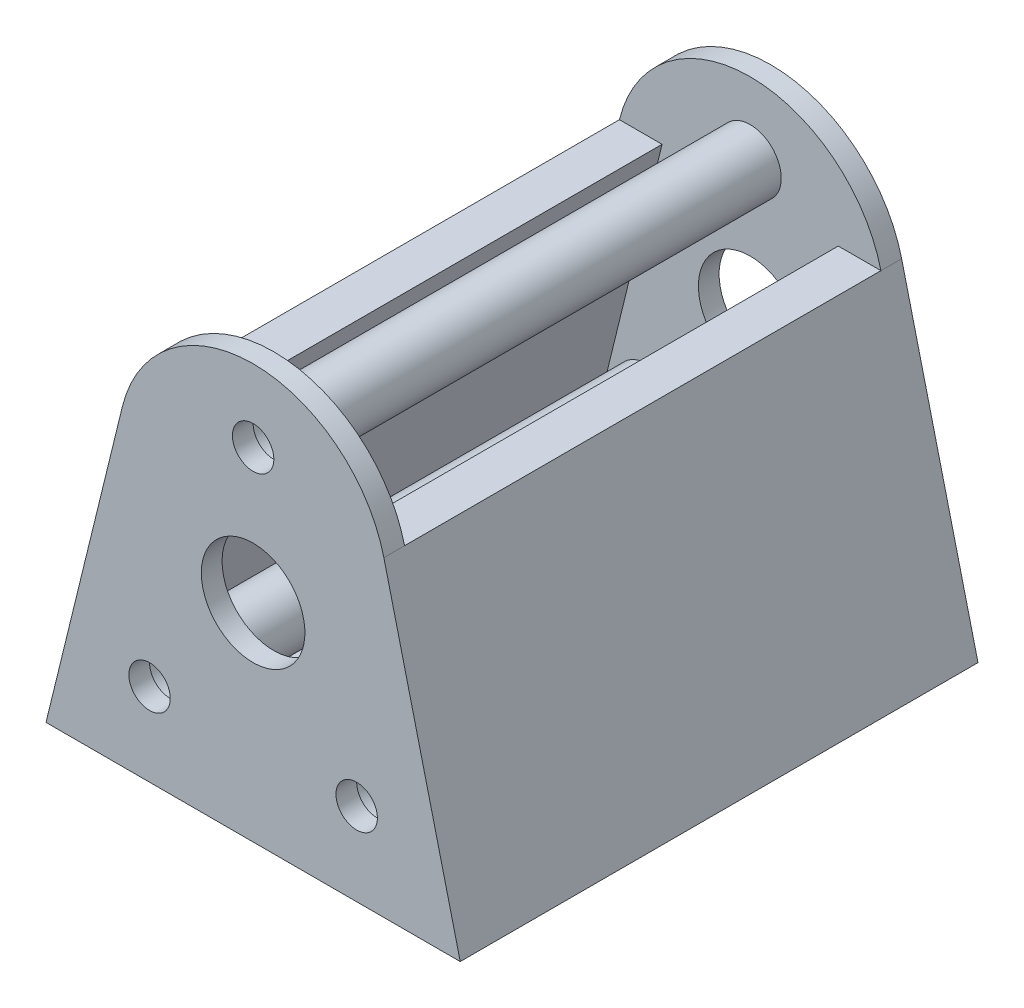
ISO-10303-21;
HEADER;
FILE_DESCRIPTION(('STEP AP214'),'2;1');
FILE_NAME('part.step','',(''),(''),'','','');
FILE_SCHEMA(('AUTOMOTIVE_DESIGN { 1 0 10303 214 1 1 1 1 }'));
ENDSEC;
DATA;
#1=APPLICATION_CONTEXT('core data for automotive mechanical design processes');
#2=APPLICATION_PROTOCOL_DEFINITION('international standard','automotive_design',2000,#1);
#3=PRODUCT_CONTEXT('',#1,'mechanical');
#4=PRODUCT('Part','Part','',(#3));
#5=PRODUCT_RELATED_PRODUCT_CATEGORY('part','',(#4));
#6=PRODUCT_DEFINITION_FORMATION('','',#4);
#7=PRODUCT_DEFINITION_CONTEXT('part definition',#1,'design');
#8=PRODUCT_DEFINITION('design','',#6,#7);
#9=PRODUCT_DEFINITION_SHAPE('','',#8);
#10=(LENGTH_UNIT() NAMED_UNIT(*) SI_UNIT(.MILLI.,.METRE.));
#11=(NAMED_UNIT(*) PLANE_ANGLE_UNIT() SI_UNIT($,.RADIAN.));
#12=(NAMED_UNIT(*) SI_UNIT($,.STERADIAN.) SOLID_ANGLE_UNIT());
#13=UNCERTAINTY_MEASURE_WITH_UNIT(LENGTH_MEASURE(1.E-05),#10,'distance_accuracy_value','');
#14=(GEOMETRIC_REPRESENTATION_CONTEXT(3) GLOBAL_UNCERTAINTY_ASSIGNED_CONTEXT((#13)) GLOBAL_UNIT_ASSIGNED_CONTEXT((#10,
#11,#12)) REPRESENTATION_CONTEXT('',''));
#15=CARTESIAN_POINT('',(0.,0.,0.));
#16=DIRECTION('',(0.,0.,1.));
#17=DIRECTION('',(1.,0.,0.));
#18=AXIS2_PLACEMENT_3D('',#15,#16,#17);
#19=CARTESIAN_POINT('',(0.,27.,2.));
#20=DIRECTION('',(0.,0.,1.));
#21=DIRECTION('',(1.,0.,0.));
#22=AXIS2_PLACEMENT_3D('',#19,#20,#21);
#23=PLANE('',#22);
#24=CARTESIAN_POINT('',(10.,8.,2.));
#25=DIRECTION('',(0.,0.,1.));
#26=DIRECTION('',(1.,0.,0.));
#27=AXIS2_PLACEMENT_3D('',#24,#25,#26);
#28=CIRCLE('',#27,3.);
#29=CARTESIAN_POINT('',(13.,8.,2.));
#30=VERTEX_POINT('',#29);
#31=EDGE_CURVE('E183',#30,#30,#28,.T.);
#32=ORIENTED_EDGE('',*,*,#31,.F.);
#33=EDGE_LOOP('',(#32));
#34=FACE_BOUND('',#33,.T.);
#35=CARTESIAN_POINT('',(0.,33.,2.));
#36=DIRECTION('',(0.,0.,1.));
#37=DIRECTION('',(1.,0.,0.));
#38=AXIS2_PLACEMENT_3D('',#35,#36,#37);
#39=CIRCLE('',#38,3.);
#40=CARTESIAN_POINT('',(3.,33.,2.));
#41=VERTEX_POINT('',#40);
#42=EDGE_CURVE('E187',#41,#41,#39,.T.);
#43=ORIENTED_EDGE('',*,*,#42,.F.);
#44=EDGE_LOOP('',(#43));
#45=FACE_BOUND('',#44,.T.);
#46=CARTESIAN_POINT('',(-10.,8.,2.));
#47=DIRECTION('',(0.,0.,1.));
#48=DIRECTION('',(1.,0.,0.));
#49=AXIS2_PLACEMENT_3D('',#46,#47,#48);
#50=CIRCLE('',#49,3.);
#51=CARTESIAN_POINT('',(-7.,8.,2.));
#52=VERTEX_POINT('',#51);
#53=EDGE_CURVE('E242',#52,#52,#50,.T.);
#54=ORIENTED_EDGE('',*,*,#53,.F.);
#55=EDGE_LOOP('',(#54));
#56=FACE_BOUND('',#55,.T.);
#57=CARTESIAN_POINT('',(0.,20.,2.));
#58=DIRECTION('',(0.,0.,1.));
#59=DIRECTION('',(1.,0.,0.));
#60=AXIS2_PLACEMENT_3D('',#57,#58,#59);
#61=CIRCLE('',#60,5.);
#62=CARTESIAN_POINT('',(5.,20.,2.));
#63=VERTEX_POINT('',#62);
#64=EDGE_CURVE('E264',#63,#63,#61,.T.);
#65=ORIENTED_EDGE('',*,*,#64,.F.);
#66=EDGE_LOOP('',(#65));
#67=FACE_BOUND('',#66,.T.);
#68=DIRECTION('',(0.23797815358121,-0.971270507334634,0.));
#69=VECTOR('',#68,1.);
#70=CARTESIAN_POINT('',(14.9016133230341,4.00000000000001,2.));
#71=LINE('',#70,#69);
#72=CARTESIAN_POINT('',(8.50819943263023,30.0937159965557,2.));
#73=VERTEX_POINT('',#72);
#74=CARTESIAN_POINT('',(14.9016133230341,4.00000000000001,2.));
#75=VERTEX_POINT('',#74);
#76=EDGE_CURVE('E60',#73,#75,#71,.T.);
#77=ORIENTED_EDGE('',*,*,#76,.F.);
#78=DIRECTION('',(-1.,0.,0.));
#79=VECTOR('',#78,1.);
#80=CARTESIAN_POINT('',(12.6265165953502,30.0937159965557,2.));
#81=LINE('',#80,#79);
#82=CARTESIAN_POINT('',(12.6265165953502,30.0937159965557,2.));
#83=VERTEX_POINT('',#82);
#84=EDGE_CURVE('E146',#83,#73,#81,.T.);
#85=ORIENTED_EDGE('',*,*,#84,.F.);
#86=CARTESIAN_POINT('',(0.,27.,2.));
#87=DIRECTION('',(0.,0.,1.));
#88=DIRECTION('',(1.,0.,0.));
#89=AXIS2_PLACEMENT_3D('',#86,#87,#88);
#90=CIRCLE('',#89,13.);
#91=CARTESIAN_POINT('',(-12.6265165953502,30.0937159965557,2.));
#92=VERTEX_POINT('',#91);
#93=EDGE_CURVE('E138',#83,#92,#90,.T.);
#94=ORIENTED_EDGE('',*,*,#93,.T.);
#95=DIRECTION('',(-1.,0.,0.));
#96=VECTOR('',#95,1.);
#97=CARTESIAN_POINT('',(-12.6265165953502,30.0937159965557,2.));
#98=LINE('',#97,#96);
#99=CARTESIAN_POINT('',(-8.50819943263023,30.0937159965557,2.));
#100=VERTEX_POINT('',#99);
#101=EDGE_CURVE('E158',#100,#92,#98,.T.);
#102=ORIENTED_EDGE('',*,*,#101,.F.);
#103=DIRECTION('',(0.23797815358121,0.971270507334634,0.));
#104=VECTOR('',#103,1.);
#105=CARTESIAN_POINT('',(-14.9016133230341,4.00000000000001,2.));
#106=LINE('',#105,#104);
#107=CARTESIAN_POINT('',(-14.9016133230341,4.00000000000001,2.));
#108=VERTEX_POINT('',#107);
#109=EDGE_CURVE('E162',#108,#100,#106,.T.);
#110=ORIENTED_EDGE('',*,*,#109,.F.);
#111=DIRECTION('',(-1.,0.,0.));
#112=VECTOR('',#111,1.);
#113=CARTESIAN_POINT('',(-19.0199304857541,4.00000000000001,2.));
#114=LINE('',#113,#112);
#115=EDGE_CURVE('E181',#75,#108,#114,.T.);
#116=ORIENTED_EDGE('',*,*,#115,.F.);
#117=EDGE_LOOP('',(#77,#85,#94,#102,#110,#116));
#118=FACE_BOUND('',#117,.T.);
#119=ADVANCED_FACE('F45',(#34,#45,#56,#67,#118),#23,.T.);
#120=CARTESIAN_POINT('',(0.,27.,48.));
#121=DIRECTION('',(0.,0.,-1.));
#122=DIRECTION('',(-1.,0.,0.));
#123=AXIS2_PLACEMENT_3D('',#120,#121,#122);
#124=PLANE('',#123);
#125=CARTESIAN_POINT('',(10.,8.,48.));
#126=DIRECTION('',(0.,0.,-1.));
#127=DIRECTION('',(1.,0.,0.));
#128=AXIS2_PLACEMENT_3D('',#125,#126,#127);
#129=CIRCLE('',#128,3.);
#130=CARTESIAN_POINT('',(13.,8.,48.));
#131=VERTEX_POINT('',#130);
#132=EDGE_CURVE('E184',#131,#131,#129,.T.);
#133=ORIENTED_EDGE('',*,*,#132,.F.);
#134=EDGE_LOOP('',(#133));
#135=FACE_BOUND('',#134,.T.);
#136=CARTESIAN_POINT('',(0.,33.,48.));
#137=DIRECTION('',(0.,0.,-1.));
#138=DIRECTION('',(-1.,0.,0.));
#139=AXIS2_PLACEMENT_3D('',#136,#137,#138);
#140=CIRCLE('',#139,3.);
#141=CARTESIAN_POINT('',(-3.,33.,48.));
#142=VERTEX_POINT('',#141);
#143=EDGE_CURVE('E190',#142,#142,#140,.T.);
#144=ORIENTED_EDGE('',*,*,#143,.F.);
#145=EDGE_LOOP('',(#144));
#146=FACE_BOUND('',#145,.T.);
#147=CARTESIAN_POINT('',(-10.,8.,48.));
#148=DIRECTION('',(0.,0.,-1.));
#149=DIRECTION('',(-1.,0.,0.));
#150=AXIS2_PLACEMENT_3D('',#147,#148,#149);
#151=CIRCLE('',#150,3.);
#152=CARTESIAN_POINT('',(-13.,8.,48.));
#153=VERTEX_POINT('',#152);
#154=EDGE_CURVE('E236',#153,#153,#151,.T.);
#155=ORIENTED_EDGE('',*,*,#154,.F.);
#156=EDGE_LOOP('',(#155));
#157=FACE_BOUND('',#156,.T.);
#158=CARTESIAN_POINT('',(0.,20.,48.));
#159=DIRECTION('',(0.,0.,-1.));
#160=DIRECTION('',(-1.,0.,0.));
#161=AXIS2_PLACEMENT_3D('',#158,#159,#160);
#162=CIRCLE('',#161,5.);
#163=CARTESIAN_POINT('',(-5.,20.,48.));
#164=VERTEX_POINT('',#163);
#165=EDGE_CURVE('E214',#164,#164,#162,.T.);
#166=ORIENTED_EDGE('',*,*,#165,.F.);
#167=EDGE_LOOP('',(#166));
#168=FACE_BOUND('',#167,.T.);
#169=CARTESIAN_POINT('',(0.,27.,48.));
#170=DIRECTION('',(0.,0.,-1.));
#171=DIRECTION('',(-1.,0.,0.));
#172=AXIS2_PLACEMENT_3D('',#169,#170,#171);
#173=CIRCLE('',#172,13.);
#174=CARTESIAN_POINT('',(-12.6265165953502,30.0937159965557,48.));
#175=VERTEX_POINT('',#174);
#176=CARTESIAN_POINT('',(12.6265165953502,30.0937159965557,48.));
#177=VERTEX_POINT('',#176);
#178=EDGE_CURVE('E220',#175,#177,#173,.T.);
#179=ORIENTED_EDGE('',*,*,#178,.T.);
#180=DIRECTION('',(1.,0.,0.));
#181=VECTOR('',#180,1.);
#182=CARTESIAN_POINT('',(12.6265165953502,30.0937159965557,48.));
#183=LINE('',#182,#181);
#184=CARTESIAN_POINT('',(8.50819943263023,30.0937159965557,48.));
#185=VERTEX_POINT('',#184);
#186=EDGE_CURVE('E68',#185,#177,#183,.T.);
#187=ORIENTED_EDGE('',*,*,#186,.F.);
#188=DIRECTION('',(-0.237978153581211,0.971270507334634,0.));
#189=VECTOR('',#188,1.);
#190=CARTESIAN_POINT('',(14.9016133230341,4.00000000000001,48.));
#191=LINE('',#190,#189);
#192=CARTESIAN_POINT('',(14.9016133230341,4.00000000000001,48.));
#193=VERTEX_POINT('',#192);
#194=EDGE_CURVE('E339',#193,#185,#191,.T.);
#195=ORIENTED_EDGE('',*,*,#194,.F.);
#196=DIRECTION('',(1.,0.,0.));
#197=VECTOR('',#196,1.);
#198=CARTESIAN_POINT('',(-19.0199304857541,4.00000000000001,48.));
#199=LINE('',#198,#197);
#200=CARTESIAN_POINT('',(-14.9016133230341,4.00000000000001,48.));
#201=VERTEX_POINT('',#200);
#202=EDGE_CURVE('E161',#201,#193,#199,.T.);
#203=ORIENTED_EDGE('',*,*,#202,.F.);
#204=DIRECTION('',(-0.237978153581211,-0.971270507334634,0.));
#205=VECTOR('',#204,1.);
#206=CARTESIAN_POINT('',(-14.9016133230341,4.00000000000001,48.));
#207=LINE('',#206,#205);
#208=CARTESIAN_POINT('',(-8.50819943263023,30.0937159965557,48.));
#209=VERTEX_POINT('',#208);
#210=EDGE_CURVE('E166',#209,#201,#207,.T.);
#211=ORIENTED_EDGE('',*,*,#210,.F.);
#212=DIRECTION('',(1.,0.,0.));
#213=VECTOR('',#212,1.);
#214=CARTESIAN_POINT('',(-12.6265165953502,30.0937159965557,48.));
#215=LINE('',#214,#213);
#216=EDGE_CURVE('E163',#175,#209,#215,.T.);
#217=ORIENTED_EDGE('',*,*,#216,.F.);
#218=EDGE_LOOP('',(#179,#187,#195,#203,#211,#217));
#219=FACE_BOUND('',#218,.T.);
#220=ADVANCED_FACE('F337',(#135,#146,#157,#168,#219),#124,.T.);
#221=CARTESIAN_POINT('',(-19.0199304857541,4.00000000000001,-38.1995024844836));
#222=DIRECTION('',(0.,-1.,0.));
#223=DIRECTION('',(1.,0.,0.));
#224=AXIS2_PLACEMENT_3D('',#221,#222,#223);
#225=PLANE('',#224);
#226=DIRECTION('',(0.,0.,1.));
#227=VECTOR('',#226,1.);
#228=CARTESIAN_POINT('',(14.9016133230341,4.00000000000001,-26.1314504468241));
#229=LINE('',#228,#227);
#230=EDGE_CURVE('E151',#75,#193,#229,.T.);
#231=ORIENTED_EDGE('',*,*,#230,.F.);
#232=ORIENTED_EDGE('',*,*,#115,.T.);
#233=DIRECTION('',(0.,0.,1.));
#234=VECTOR('',#233,1.);
#235=CARTESIAN_POINT('',(-14.9016133230341,4.00000000000001,-26.1314504468241));
#236=LINE('',#235,#234);
#237=EDGE_CURVE('E169',#108,#201,#236,.T.);
#238=ORIENTED_EDGE('',*,*,#237,.T.);
#239=ORIENTED_EDGE('',*,*,#202,.T.);
#240=EDGE_LOOP('',(#231,#232,#238,#239));
#241=FACE_BOUND('',#240,.T.);
#242=ADVANCED_FACE('F336',(#241),#225,.F.);
#243=CARTESIAN_POINT('',(10.,8.,2.));
#244=DIRECTION('',(0.,0.,1.));
#245=DIRECTION('',(1.,0.,0.));
#246=AXIS2_PLACEMENT_3D('',#243,#244,#245);
#247=CIRCLE('',#246,2.);
#248=CARTESIAN_POINT('',(12.,8.,2.));
#249=VERTEX_POINT('',#248);
#250=EDGE_CURVE('E252',#249,#249,#247,.T.);
#251=ORIENTED_EDGE('',*,*,#250,.F.);
#252=EDGE_LOOP('',(#251));
#253=FACE_BOUND('',#252,.T.);
#254=CARTESIAN_POINT('',(10.,8.,2.));
#255=DIRECTION('',(0.,0.,1.));
#256=DIRECTION('',(1.,0.,0.));
#257=AXIS2_PLACEMENT_3D('',#254,#255,#256);
#258=CIRCLE('',#257,2.5);
#259=CARTESIAN_POINT('',(12.5,8.,2.));
#260=VERTEX_POINT('',#259);
#261=EDGE_CURVE('E291',#260,#260,#258,.F.);
#262=ORIENTED_EDGE('',*,*,#261,.F.);
#263=EDGE_LOOP('',(#262));
#264=FACE_BOUND('',#263,.T.);
#265=ADVANCED_FACE('F403',(#253,#264),#23,.T.);
#266=CARTESIAN_POINT('',(10.,8.,48.));
#267=DIRECTION('',(0.,0.,-1.));
#268=DIRECTION('',(-1.,0.,0.));
#269=AXIS2_PLACEMENT_3D('',#266,#267,#268);
#270=CIRCLE('',#269,2.);
#271=CARTESIAN_POINT('',(8.,8.,48.));
#272=VERTEX_POINT('',#271);
#273=EDGE_CURVE('E196',#272,#272,#270,.T.);
#274=ORIENTED_EDGE('',*,*,#273,.F.);
#275=EDGE_LOOP('',(#274));
#276=FACE_BOUND('',#275,.T.);
#277=CARTESIAN_POINT('',(10.,8.,48.));
#278=DIRECTION('',(0.,0.,-1.));
#279=DIRECTION('',(-1.,0.,0.));
#280=AXIS2_PLACEMENT_3D('',#277,#278,#279);
#281=CIRCLE('',#280,2.5);
#282=CARTESIAN_POINT('',(7.5,8.,48.));
#283=VERTEX_POINT('',#282);
#284=EDGE_CURVE('E288',#283,#283,#281,.F.);
#285=ORIENTED_EDGE('',*,*,#284,.F.);
#286=EDGE_LOOP('',(#285));
#287=FACE_BOUND('',#286,.T.);
#288=ADVANCED_FACE('F410',(#276,#287),#124,.T.);
#289=CARTESIAN_POINT('',(0.,33.,2.));
#290=DIRECTION('',(0.,0.,1.));
#291=DIRECTION('',(1.,0.,0.));
#292=AXIS2_PLACEMENT_3D('',#289,#290,#291);
#293=CIRCLE('',#292,2.);
#294=CARTESIAN_POINT('',(2.,33.,2.));
#295=VERTEX_POINT('',#294);
#296=EDGE_CURVE('E258',#295,#295,#293,.T.);
#297=ORIENTED_EDGE('',*,*,#296,.F.);
#298=EDGE_LOOP('',(#297));
#299=FACE_BOUND('',#298,.T.);
#300=CARTESIAN_POINT('',(0.,33.,2.));
#301=DIRECTION('',(0.,0.,1.));
#302=DIRECTION('',(1.,0.,0.));
#303=AXIS2_PLACEMENT_3D('',#300,#301,#302);
#304=CIRCLE('',#303,2.5);
#305=CARTESIAN_POINT('',(2.5,33.,2.));
#306=VERTEX_POINT('',#305);
#307=EDGE_CURVE('E285',#306,#306,#304,.F.);
#308=ORIENTED_EDGE('',*,*,#307,.F.);
#309=EDGE_LOOP('',(#308));
#310=FACE_BOUND('',#309,.T.);
#311=ADVANCED_FACE('F418',(#299,#310),#23,.T.);
#312=CARTESIAN_POINT('',(0.,33.,48.));
#313=DIRECTION('',(0.,0.,-1.));
#314=DIRECTION('',(-1.,0.,0.));
#315=AXIS2_PLACEMENT_3D('',#312,#313,#314);
#316=CIRCLE('',#315,2.);
#317=CARTESIAN_POINT('',(-2.,33.,48.));
#318=VERTEX_POINT('',#317);
#319=EDGE_CURVE('E208',#318,#318,#316,.T.);
#320=ORIENTED_EDGE('',*,*,#319,.F.);
#321=EDGE_LOOP('',(#320));
#322=FACE_BOUND('',#321,.T.);
#323=CARTESIAN_POINT('',(0.,33.,48.));
#324=DIRECTION('',(0.,0.,-1.));
#325=DIRECTION('',(-1.,0.,0.));
#326=AXIS2_PLACEMENT_3D('',#323,#324,#325);
#327=CIRCLE('',#326,2.5);
#328=CARTESIAN_POINT('',(-2.5,33.,48.));
#329=VERTEX_POINT('',#328);
#330=EDGE_CURVE('E282',#329,#329,#327,.F.);
#331=ORIENTED_EDGE('',*,*,#330,.F.);
#332=EDGE_LOOP('',(#331));
#333=FACE_BOUND('',#332,.T.);
#334=ADVANCED_FACE('F420',(#322,#333),#124,.T.);
#335=CARTESIAN_POINT('',(-10.,8.,2.));
#336=DIRECTION('',(0.,0.,1.));
#337=DIRECTION('',(1.,0.,0.));
#338=AXIS2_PLACEMENT_3D('',#335,#336,#337);
#339=CIRCLE('',#338,2.);
#340=CARTESIAN_POINT('',(-8.,8.,2.));
#341=VERTEX_POINT('',#340);
#342=EDGE_CURVE('E246',#341,#341,#339,.T.);
#343=ORIENTED_EDGE('',*,*,#342,.F.);
#344=EDGE_LOOP('',(#343));
#345=FACE_BOUND('',#344,.T.);
#346=CARTESIAN_POINT('',(-10.,8.,2.));
#347=DIRECTION('',(0.,0.,1.));
#348=DIRECTION('',(1.,0.,0.));
#349=AXIS2_PLACEMENT_3D('',#346,#347,#348);
#350=CIRCLE('',#349,2.5);
#351=CARTESIAN_POINT('',(-7.5,8.,2.));
#352=VERTEX_POINT('',#351);
#353=EDGE_CURVE('E134',#352,#352,#350,.F.);
#354=ORIENTED_EDGE('',*,*,#353,.F.);
#355=EDGE_LOOP('',(#354));
#356=FACE_BOUND('',#355,.T.);
#357=ADVANCED_FACE('F404',(#345,#356),#23,.T.);
#358=CARTESIAN_POINT('',(0.,27.,0.));
#359=DIRECTION('',(0.,0.,1.));
#360=DIRECTION('',(1.,0.,0.));
#361=AXIS2_PLACEMENT_3D('',#358,#359,#360);
#362=PLANE('',#361);
#363=DIRECTION('',(-0.237978153581211,0.971270507334634,0.));
#364=VECTOR('',#363,1.);
#365=CARTESIAN_POINT('',(20.,0.,0.));
#366=LINE('',#365,#364);
#367=CARTESIAN_POINT('',(20.,0.,0.));
#368=VERTEX_POINT('',#367);
#369=CARTESIAN_POINT('',(12.6265165953502,30.0937159965557,0.));
#370=VERTEX_POINT('',#369);
#371=EDGE_CURVE('E132',#368,#370,#366,.T.);
#372=ORIENTED_EDGE('',*,*,#371,.F.);
#373=DIRECTION('',(1.,0.,0.));
#374=VECTOR('',#373,1.);
#375=CARTESIAN_POINT('',(-20.,0.,0.));
#376=LINE('',#375,#374);
#377=CARTESIAN_POINT('',(-20.,0.,0.));
#378=VERTEX_POINT('',#377);
#379=EDGE_CURVE('E143',#378,#368,#376,.T.);
#380=ORIENTED_EDGE('',*,*,#379,.F.);
#381=DIRECTION('',(-0.237978153581211,-0.971270507334634,0.));
#382=VECTOR('',#381,1.);
#383=CARTESIAN_POINT('',(-20.,0.,0.));
#384=LINE('',#383,#382);
#385=CARTESIAN_POINT('',(-12.6265165953502,30.0937159965557,0.));
#386=VERTEX_POINT('',#385);
#387=EDGE_CURVE('E272',#386,#378,#384,.T.);
#388=ORIENTED_EDGE('',*,*,#387,.F.);
#389=CARTESIAN_POINT('',(0.,27.,0.));
#390=DIRECTION('',(0.,0.,1.));
#391=DIRECTION('',(1.,0.,0.));
#392=AXIS2_PLACEMENT_3D('',#389,#390,#391);
#393=CIRCLE('',#392,13.);
#394=EDGE_CURVE('E270',#370,#386,#393,.T.);
#395=ORIENTED_EDGE('',*,*,#394,.F.);
#396=EDGE_LOOP('',(#372,#380,#388,#395));
#397=FACE_BOUND('',#396,.T.);
#398=CARTESIAN_POINT('',(0.,20.,0.));
#399=DIRECTION('',(0.,0.,1.));
#400=DIRECTION('',(1.,0.,0.));
#401=AXIS2_PLACEMENT_3D('',#398,#399,#400);
#402=CIRCLE('',#401,5.);
#403=CARTESIAN_POINT('',(5.,20.,0.));
#404=VERTEX_POINT('',#403);
#405=EDGE_CURVE('E261',#404,#404,#402,.T.);
#406=ORIENTED_EDGE('',*,*,#405,.T.);
#407=EDGE_LOOP('',(#406));
#408=FACE_BOUND('',#407,.T.);
#409=CARTESIAN_POINT('',(0.,33.,0.));
#410=DIRECTION('',(0.,0.,1.));
#411=DIRECTION('',(1.,0.,0.));
#412=AXIS2_PLACEMENT_3D('',#409,#410,#411);
#413=CIRCLE('',#412,2.);
#414=CARTESIAN_POINT('',(2.,33.,0.));
#415=VERTEX_POINT('',#414);
#416=EDGE_CURVE('E255',#415,#415,#413,.T.);
#417=ORIENTED_EDGE('',*,*,#416,.T.);
#418=EDGE_LOOP('',(#417));
#419=FACE_BOUND('',#418,.T.);
#420=CARTESIAN_POINT('',(10.,8.,0.));
#421=DIRECTION('',(0.,0.,1.));
#422=DIRECTION('',(1.,0.,0.));
#423=AXIS2_PLACEMENT_3D('',#420,#421,#422);
#424=CIRCLE('',#423,2.);
#425=CARTESIAN_POINT('',(12.,8.,0.));
#426=VERTEX_POINT('',#425);
#427=EDGE_CURVE('E249',#426,#426,#424,.T.);
#428=ORIENTED_EDGE('',*,*,#427,.T.);
#429=EDGE_LOOP('',(#428));
#430=FACE_BOUND('',#429,.T.);
#431=CARTESIAN_POINT('',(-10.,8.,0.));
#432=DIRECTION('',(0.,0.,1.));
#433=DIRECTION('',(1.,0.,0.));
#434=AXIS2_PLACEMENT_3D('',#431,#432,#433);
#435=CIRCLE('',#434,2.);
#436=CARTESIAN_POINT('',(-8.,8.,0.));
#437=VERTEX_POINT('',#436);
#438=EDGE_CURVE('E245',#437,#437,#435,.T.);
#439=ORIENTED_EDGE('',*,*,#438,.T.);
#440=EDGE_LOOP('',(#439));
#441=FACE_BOUND('',#440,.T.);
#442=ADVANCED_FACE('F322',(#397,#408,#419,#430,#441),#362,.F.);
#443=CARTESIAN_POINT('',(20.,0.,2.));
#444=DIRECTION('',(-0.971270507334634,-0.237978153581211,0.));
#445=DIRECTION('',(0.237978153581211,-0.971270507334634,0.));
#446=AXIS2_PLACEMENT_3D('',#443,#444,#445);
#447=PLANE('',#446);
#448=DIRECTION('',(0.,0.,1.));
#449=VECTOR('',#448,1.);
#450=CARTESIAN_POINT('',(12.6265165953502,30.0937159965557,-26.1314504468241));
#451=LINE('',#450,#449);
#452=EDGE_CURVE('E129',#83,#177,#451,.T.);
#453=ORIENTED_EDGE('',*,*,#452,.T.);
#454=DIRECTION('',(0.,0.,1.));
#455=VECTOR('',#454,1.);
#456=CARTESIAN_POINT('',(12.6265165953502,30.0937159965557,48.));
#457=LINE('',#456,#455);
#458=CARTESIAN_POINT('',(12.6265165953502,30.0937159965557,50.));
#459=VERTEX_POINT('',#458);
#460=EDGE_CURVE('E222',#177,#459,#457,.T.);
#461=ORIENTED_EDGE('',*,*,#460,.T.);
#462=DIRECTION('',(0.237978153581211,-0.971270507334634,0.));
#463=VECTOR('',#462,1.);
#464=CARTESIAN_POINT('',(12.6265165953502,30.0937159965557,50.));
#465=LINE('',#464,#463);
#466=CARTESIAN_POINT('',(20.,0.,50.));
#467=VERTEX_POINT('',#466);
#468=EDGE_CURVE('E223',#459,#467,#465,.T.);
#469=ORIENTED_EDGE('',*,*,#468,.T.);
#470=DIRECTION('',(0.,0.,-1.));
#471=VECTOR('',#470,1.);
#472=CARTESIAN_POINT('',(20.,0.,2.));
#473=LINE('',#472,#471);
#474=EDGE_CURVE('E142',#467,#368,#473,.T.);
#475=ORIENTED_EDGE('',*,*,#474,.T.);
#476=ORIENTED_EDGE('',*,*,#371,.T.);
#477=DIRECTION('',(0.,0.,-1.));
#478=VECTOR('',#477,1.);
#479=CARTESIAN_POINT('',(12.6265165953502,30.0937159965557,2.));
#480=LINE('',#479,#478);
#481=EDGE_CURVE('E125',#83,#370,#480,.T.);
#482=ORIENTED_EDGE('',*,*,#481,.F.);
#483=EDGE_LOOP('',(#453,#461,#469,#475,#476,#482));
#484=FACE_BOUND('',#483,.T.);
#485=ADVANCED_FACE('F47',(#484),#447,.F.);
#486=CARTESIAN_POINT('',(0.,27.,2.));
#487=DIRECTION('',(0.,0.,-1.));
#488=DIRECTION('',(-1.,0.,0.));
#489=AXIS2_PLACEMENT_3D('',#486,#487,#488);
#490=CYLINDRICAL_SURFACE('',#489,13.);
#491=ORIENTED_EDGE('',*,*,#394,.T.);
#492=DIRECTION('',(0.,0.,-1.));
#493=VECTOR('',#492,1.);
#494=CARTESIAN_POINT('',(-12.6265165953502,30.0937159965557,2.));
#495=LINE('',#494,#493);
#496=EDGE_CURVE('E135',#92,#386,#495,.T.);
#497=ORIENTED_EDGE('',*,*,#496,.F.);
#498=ORIENTED_EDGE('',*,*,#93,.F.);
#499=ORIENTED_EDGE('',*,*,#481,.T.);
#500=EDGE_LOOP('',(#491,#497,#498,#499));
#501=FACE_BOUND('',#500,.T.);
#502=ADVANCED_FACE('F139',(#501),#490,.T.);
#503=CARTESIAN_POINT('',(-20.,0.,2.));
#504=DIRECTION('',(0.971270507334634,-0.237978153581211,0.));
#505=DIRECTION('',(0.237978153581211,0.971270507334634,0.));
#506=AXIS2_PLACEMENT_3D('',#503,#504,#505);
#507=PLANE('',#506);
#508=DIRECTION('',(0.,0.,1.));
#509=VECTOR('',#508,1.);
#510=CARTESIAN_POINT('',(-12.6265165953502,30.0937159965557,48.));
#511=LINE('',#510,#509);
#512=CARTESIAN_POINT('',(-12.6265165953502,30.0937159965557,50.));
#513=VERTEX_POINT('',#512);
#514=EDGE_CURVE('E233',#175,#513,#511,.T.);
#515=ORIENTED_EDGE('',*,*,#514,.F.);
#516=DIRECTION('',(0.,0.,1.));
#517=VECTOR('',#516,1.);
#518=CARTESIAN_POINT('',(-12.6265165953502,30.0937159965557,-26.1314504468241));
#519=LINE('',#518,#517);
#520=EDGE_CURVE('E174',#92,#175,#519,.T.);
#521=ORIENTED_EDGE('',*,*,#520,.F.);
#522=ORIENTED_EDGE('',*,*,#496,.T.);
#523=ORIENTED_EDGE('',*,*,#387,.T.);
#524=DIRECTION('',(0.,0.,-1.));
#525=VECTOR('',#524,1.);
#526=CARTESIAN_POINT('',(-20.,0.,2.));
#527=LINE('',#526,#525);
#528=CARTESIAN_POINT('',(-20.,0.,50.));
#529=VERTEX_POINT('',#528);
#530=EDGE_CURVE('E276',#529,#378,#527,.T.);
#531=ORIENTED_EDGE('',*,*,#530,.F.);
#532=DIRECTION('',(0.237978153581211,0.971270507334634,0.));
#533=VECTOR('',#532,1.);
#534=CARTESIAN_POINT('',(-20.,0.,50.));
#535=LINE('',#534,#533);
#536=EDGE_CURVE('E226',#529,#513,#535,.T.);
#537=ORIENTED_EDGE('',*,*,#536,.T.);
#538=EDGE_LOOP('',(#515,#521,#522,#523,#531,#537));
#539=FACE_BOUND('',#538,.T.);
#540=ADVANCED_FACE('F308',(#539),#507,.F.);
#541=CARTESIAN_POINT('',(-20.,0.,2.));
#542=DIRECTION('',(0.,1.,0.));
#543=DIRECTION('',(0.,0.,1.));
#544=AXIS2_PLACEMENT_3D('',#541,#542,#543);
#545=PLANE('',#544);
#546=CARTESIAN_POINT('',(10.,0.,37.5));
#547=DIRECTION('',(0.,1.,0.));
#548=DIRECTION('',(0.,0.,1.));
#549=AXIS2_PLACEMENT_3D('',#546,#547,#548);
#550=CIRCLE('',#549,5.);
#551=CARTESIAN_POINT('',(10.,0.,42.5));
#552=VERTEX_POINT('',#551);
#553=EDGE_CURVE('E13',#552,#552,#550,.F.);
#554=ORIENTED_EDGE('',*,*,#553,.F.);
#555=EDGE_LOOP('',(#554));
#556=FACE_BOUND('',#555,.T.);
#557=CARTESIAN_POINT('',(10.,0.,12.5));
#558=DIRECTION('',(0.,1.,0.));
#559=DIRECTION('',(0.,0.,1.));
#560=AXIS2_PLACEMENT_3D('',#557,#558,#559);
#561=CIRCLE('',#560,5.);
#562=CARTESIAN_POINT('',(10.,0.,17.5));
#563=VERTEX_POINT('',#562);
#564=EDGE_CURVE('E53',#563,#563,#561,.F.);
#565=ORIENTED_EDGE('',*,*,#564,.F.);
#566=EDGE_LOOP('',(#565));
#567=FACE_BOUND('',#566,.T.);
#568=CARTESIAN_POINT('',(-10.,0.,37.5));
#569=DIRECTION('',(0.,1.,0.));
#570=DIRECTION('',(0.,0.,1.));
#571=AXIS2_PLACEMENT_3D('',#568,#569,#570);
#572=CIRCLE('',#571,5.);
#573=CARTESIAN_POINT('',(-10.,0.,42.5));
#574=VERTEX_POINT('',#573);
#575=EDGE_CURVE('E297',#574,#574,#572,.F.);
#576=ORIENTED_EDGE('',*,*,#575,.F.);
#577=EDGE_LOOP('',(#576));
#578=FACE_BOUND('',#577,.T.);
#579=CARTESIAN_POINT('',(-10.,0.,12.5));
#580=DIRECTION('',(0.,1.,0.));
#581=DIRECTION('',(0.,0.,1.));
#582=AXIS2_PLACEMENT_3D('',#579,#580,#581);
#583=CIRCLE('',#582,5.);
#584=CARTESIAN_POINT('',(-10.,0.,17.5));
#585=VERTEX_POINT('',#584);
#586=EDGE_CURVE('E294',#585,#585,#583,.F.);
#587=ORIENTED_EDGE('',*,*,#586,.F.);
#588=EDGE_LOOP('',(#587));
#589=FACE_BOUND('',#588,.T.);
#590=ORIENTED_EDGE('',*,*,#379,.T.);
#591=ORIENTED_EDGE('',*,*,#474,.F.);
#592=DIRECTION('',(-1.,0.,0.));
#593=VECTOR('',#592,1.);
#594=CARTESIAN_POINT('',(20.,0.,50.));
#595=LINE('',#594,#593);
#596=EDGE_CURVE('E217',#467,#529,#595,.T.);
#597=ORIENTED_EDGE('',*,*,#596,.T.);
#598=ORIENTED_EDGE('',*,*,#530,.T.);
#599=EDGE_LOOP('',(#590,#591,#597,#598));
#600=FACE_BOUND('',#599,.T.);
#601=ADVANCED_FACE('F304',(#556,#567,#578,#589,#600),#545,.F.);
#602=CARTESIAN_POINT('',(0.,20.,2.));
#603=DIRECTION('',(0.,0.,-1.));
#604=DIRECTION('',(-1.,0.,0.));
#605=AXIS2_PLACEMENT_3D('',#602,#603,#604);
#606=CYLINDRICAL_SURFACE('',#605,5.);
#607=ORIENTED_EDGE('',*,*,#64,.T.);
#608=EDGE_LOOP('',(#607));
#609=FACE_BOUND('',#608,.T.);
#610=ORIENTED_EDGE('',*,*,#405,.F.);
#611=EDGE_LOOP('',(#610));
#612=FACE_BOUND('',#611,.T.);
#613=ADVANCED_FACE('F307',(#609,#612),#606,.F.);
#614=CARTESIAN_POINT('',(0.,33.,2.));
#615=DIRECTION('',(0.,0.,-1.));
#616=DIRECTION('',(-1.,0.,0.));
#617=AXIS2_PLACEMENT_3D('',#614,#615,#616);
#618=CYLINDRICAL_SURFACE('',#617,2.);
#619=ORIENTED_EDGE('',*,*,#296,.T.);
#620=EDGE_LOOP('',(#619));
#621=FACE_BOUND('',#620,.T.);
#622=ORIENTED_EDGE('',*,*,#416,.F.);
#623=EDGE_LOOP('',(#622));
#624=FACE_BOUND('',#623,.T.);
#625=ADVANCED_FACE('F493',(#621,#624),#618,.F.);
#626=CARTESIAN_POINT('',(10.,8.,2.));
#627=DIRECTION('',(0.,0.,-1.));
#628=DIRECTION('',(-1.,0.,0.));
#629=AXIS2_PLACEMENT_3D('',#626,#627,#628);
#630=CYLINDRICAL_SURFACE('',#629,2.);
#631=ORIENTED_EDGE('',*,*,#250,.T.);
#632=EDGE_LOOP('',(#631));
#633=FACE_BOUND('',#632,.T.);
#634=ORIENTED_EDGE('',*,*,#427,.F.);
#635=EDGE_LOOP('',(#634));
#636=FACE_BOUND('',#635,.T.);
#637=ADVANCED_FACE('F489',(#633,#636),#630,.F.);
#638=CARTESIAN_POINT('',(-10.,8.,2.));
#639=DIRECTION('',(0.,0.,-1.));
#640=DIRECTION('',(-1.,0.,0.));
#641=AXIS2_PLACEMENT_3D('',#638,#639,#640);
#642=CYLINDRICAL_SURFACE('',#641,2.);
#643=ORIENTED_EDGE('',*,*,#342,.T.);
#644=EDGE_LOOP('',(#643));
#645=FACE_BOUND('',#644,.T.);
#646=ORIENTED_EDGE('',*,*,#438,.F.);
#647=EDGE_LOOP('',(#646));
#648=FACE_BOUND('',#647,.T.);
#649=ADVANCED_FACE('F482',(#645,#648),#642,.F.);
#650=CARTESIAN_POINT('',(-10.,8.,-6.48528137423857));
#651=DIRECTION('',(0.,0.,1.));
#652=DIRECTION('',(1.,0.,0.));
#653=AXIS2_PLACEMENT_3D('',#650,#651,#652);
#654=CYLINDRICAL_SURFACE('',#653,3.);
#655=ORIENTED_EDGE('',*,*,#53,.T.);
#656=EDGE_LOOP('',(#655));
#657=FACE_BOUND('',#656,.T.);
#658=ORIENTED_EDGE('',*,*,#154,.T.);
#659=EDGE_LOOP('',(#658));
#660=FACE_BOUND('',#659,.T.);
#661=ADVANCED_FACE('F478',(#657,#660),#654,.T.);
#662=CARTESIAN_POINT('',(-10.,8.,-6.48528137423857));
#663=DIRECTION('',(0.,0.,1.));
#664=DIRECTION('',(1.,0.,0.));
#665=AXIS2_PLACEMENT_3D('',#662,#663,#664);
#666=CYLINDRICAL_SURFACE('',#665,2.5);
#667=ORIENTED_EDGE('',*,*,#353,.T.);
#668=EDGE_LOOP('',(#667));
#669=FACE_BOUND('',#668,.T.);
#670=CARTESIAN_POINT('',(-10.,8.,48.));
#671=DIRECTION('',(0.,0.,-1.));
#672=DIRECTION('',(-1.,0.,0.));
#673=AXIS2_PLACEMENT_3D('',#670,#671,#672);
#674=CIRCLE('',#673,2.5);
#675=CARTESIAN_POINT('',(-12.5,8.,48.));
#676=VERTEX_POINT('',#675);
#677=EDGE_CURVE('E239',#676,#676,#674,.T.);
#678=ORIENTED_EDGE('',*,*,#677,.F.);
#679=EDGE_LOOP('',(#678));
#680=FACE_BOUND('',#679,.T.);
#681=ADVANCED_FACE('F481',(#669,#680),#666,.F.);
#682=CARTESIAN_POINT('',(-10.,8.,48.));
#683=DIRECTION('',(0.,0.,-1.));
#684=DIRECTION('',(-1.,0.,0.));
#685=AXIS2_PLACEMENT_3D('',#682,#683,#684);
#686=CIRCLE('',#685,2.);
#687=CARTESIAN_POINT('',(-12.,8.,48.));
#688=VERTEX_POINT('',#687);
#689=EDGE_CURVE('E202',#688,#688,#686,.T.);
#690=ORIENTED_EDGE('',*,*,#689,.F.);
#691=EDGE_LOOP('',(#690));
#692=FACE_BOUND('',#691,.T.);
#693=ORIENTED_EDGE('',*,*,#677,.T.);
#694=EDGE_LOOP('',(#693));
#695=FACE_BOUND('',#694,.T.);
#696=ADVANCED_FACE('F411',(#692,#695),#124,.T.);
#697=CARTESIAN_POINT('',(0.,27.,50.));
#698=DIRECTION('',(0.,0.,-1.));
#699=DIRECTION('',(-1.,0.,0.));
#700=AXIS2_PLACEMENT_3D('',#697,#698,#699);
#701=PLANE('',#700);
#702=ORIENTED_EDGE('',*,*,#596,.F.);
#703=ORIENTED_EDGE('',*,*,#468,.F.);
#704=CARTESIAN_POINT('',(0.,27.,50.));
#705=DIRECTION('',(0.,0.,-1.));
#706=DIRECTION('',(-1.,0.,0.));
#707=AXIS2_PLACEMENT_3D('',#704,#705,#706);
#708=CIRCLE('',#707,13.);
#709=EDGE_CURVE('E228',#513,#459,#708,.T.);
#710=ORIENTED_EDGE('',*,*,#709,.F.);
#711=ORIENTED_EDGE('',*,*,#536,.F.);
#712=EDGE_LOOP('',(#702,#703,#710,#711));
#713=FACE_BOUND('',#712,.T.);
#714=CARTESIAN_POINT('',(0.,20.,50.));
#715=DIRECTION('',(0.,0.,-1.));
#716=DIRECTION('',(-1.,0.,0.));
#717=AXIS2_PLACEMENT_3D('',#714,#715,#716);
#718=CIRCLE('',#717,5.);
#719=CARTESIAN_POINT('',(-5.,20.,50.));
#720=VERTEX_POINT('',#719);
#721=EDGE_CURVE('E211',#720,#720,#718,.T.);
#722=ORIENTED_EDGE('',*,*,#721,.T.);
#723=EDGE_LOOP('',(#722));
#724=FACE_BOUND('',#723,.T.);
#725=CARTESIAN_POINT('',(0.,33.,50.));
#726=DIRECTION('',(0.,0.,-1.));
#727=DIRECTION('',(-1.,0.,0.));
#728=AXIS2_PLACEMENT_3D('',#725,#726,#727);
#729=CIRCLE('',#728,2.);
#730=CARTESIAN_POINT('',(-2.,33.,50.));
#731=VERTEX_POINT('',#730);
#732=EDGE_CURVE('E205',#731,#731,#729,.T.);
#733=ORIENTED_EDGE('',*,*,#732,.T.);
#734=EDGE_LOOP('',(#733));
#735=FACE_BOUND('',#734,.T.);
#736=CARTESIAN_POINT('',(-10.,8.,50.));
#737=DIRECTION('',(0.,0.,-1.));
#738=DIRECTION('',(-1.,0.,0.));
#739=AXIS2_PLACEMENT_3D('',#736,#737,#738);
#740=CIRCLE('',#739,2.);
#741=CARTESIAN_POINT('',(-12.,8.,50.));
#742=VERTEX_POINT('',#741);
#743=EDGE_CURVE('E199',#742,#742,#740,.T.);
#744=ORIENTED_EDGE('',*,*,#743,.T.);
#745=EDGE_LOOP('',(#744));
#746=FACE_BOUND('',#745,.T.);
#747=CARTESIAN_POINT('',(10.,8.,50.));
#748=DIRECTION('',(0.,0.,-1.));
#749=DIRECTION('',(-1.,0.,0.));
#750=AXIS2_PLACEMENT_3D('',#747,#748,#749);
#751=CIRCLE('',#750,2.);
#752=CARTESIAN_POINT('',(8.,8.,50.));
#753=VERTEX_POINT('',#752);
#754=EDGE_CURVE('E193',#753,#753,#751,.T.);
#755=ORIENTED_EDGE('',*,*,#754,.T.);
#756=EDGE_LOOP('',(#755));
#757=FACE_BOUND('',#756,.T.);
#758=ADVANCED_FACE('F471',(#713,#724,#735,#746,#757),#701,.F.);
#759=CARTESIAN_POINT('',(0.,27.,48.));
#760=DIRECTION('',(0.,0.,1.));
#761=DIRECTION('',(1.,0.,0.));
#762=AXIS2_PLACEMENT_3D('',#759,#760,#761);
#763=CYLINDRICAL_SURFACE('',#762,13.);
#764=ORIENTED_EDGE('',*,*,#709,.T.);
#765=ORIENTED_EDGE('',*,*,#460,.F.);
#766=ORIENTED_EDGE('',*,*,#178,.F.);
#767=ORIENTED_EDGE('',*,*,#514,.T.);
#768=EDGE_LOOP('',(#764,#765,#766,#767));
#769=FACE_BOUND('',#768,.T.);
#770=ADVANCED_FACE('F468',(#769),#763,.T.);
#771=CARTESIAN_POINT('',(0.,20.,48.));
#772=DIRECTION('',(0.,0.,1.));
#773=DIRECTION('',(1.,0.,0.));
#774=AXIS2_PLACEMENT_3D('',#771,#772,#773);
#775=CYLINDRICAL_SURFACE('',#774,5.);
#776=ORIENTED_EDGE('',*,*,#165,.T.);
#777=EDGE_LOOP('',(#776));
#778=FACE_BOUND('',#777,.T.);
#779=ORIENTED_EDGE('',*,*,#721,.F.);
#780=EDGE_LOOP('',(#779));
#781=FACE_BOUND('',#780,.T.);
#782=ADVANCED_FACE('F465',(#778,#781),#775,.F.);
#783=CARTESIAN_POINT('',(0.,33.,48.));
#784=DIRECTION('',(0.,0.,1.));
#785=DIRECTION('',(1.,0.,0.));
#786=AXIS2_PLACEMENT_3D('',#783,#784,#785);
#787=CYLINDRICAL_SURFACE('',#786,2.);
#788=ORIENTED_EDGE('',*,*,#319,.T.);
#789=EDGE_LOOP('',(#788));
#790=FACE_BOUND('',#789,.T.);
#791=ORIENTED_EDGE('',*,*,#732,.F.);
#792=EDGE_LOOP('',(#791));
#793=FACE_BOUND('',#792,.T.);
#794=ADVANCED_FACE('F461',(#790,#793),#787,.F.);
#795=CARTESIAN_POINT('',(-10.,8.,48.));
#796=DIRECTION('',(0.,0.,1.));
#797=DIRECTION('',(1.,0.,0.));
#798=AXIS2_PLACEMENT_3D('',#795,#796,#797);
#799=CYLINDRICAL_SURFACE('',#798,2.);
#800=ORIENTED_EDGE('',*,*,#689,.T.);
#801=EDGE_LOOP('',(#800));
#802=FACE_BOUND('',#801,.T.);
#803=ORIENTED_EDGE('',*,*,#743,.F.);
#804=EDGE_LOOP('',(#803));
#805=FACE_BOUND('',#804,.T.);
#806=ADVANCED_FACE('F454',(#802,#805),#799,.F.);
#807=CARTESIAN_POINT('',(10.,8.,48.));
#808=DIRECTION('',(0.,0.,1.));
#809=DIRECTION('',(1.,0.,0.));
#810=AXIS2_PLACEMENT_3D('',#807,#808,#809);
#811=CYLINDRICAL_SURFACE('',#810,2.);
#812=ORIENTED_EDGE('',*,*,#273,.T.);
#813=EDGE_LOOP('',(#812));
#814=FACE_BOUND('',#813,.T.);
#815=ORIENTED_EDGE('',*,*,#754,.F.);
#816=EDGE_LOOP('',(#815));
#817=FACE_BOUND('',#816,.T.);
#818=ADVANCED_FACE('F443',(#814,#817),#811,.F.);
#819=CARTESIAN_POINT('',(0.,33.,-6.48528137423857));
#820=DIRECTION('',(0.,0.,1.));
#821=DIRECTION('',(1.,0.,0.));
#822=AXIS2_PLACEMENT_3D('',#819,#820,#821);
#823=CYLINDRICAL_SURFACE('',#822,2.5);
#824=ORIENTED_EDGE('',*,*,#307,.T.);
#825=EDGE_LOOP('',(#824));
#826=FACE_BOUND('',#825,.T.);
#827=ORIENTED_EDGE('',*,*,#330,.T.);
#828=EDGE_LOOP('',(#827));
#829=FACE_BOUND('',#828,.T.);
#830=ADVANCED_FACE('F439',(#826,#829),#823,.F.);
#831=CARTESIAN_POINT('',(0.,33.,-6.48528137423857));
#832=DIRECTION('',(0.,0.,1.));
#833=DIRECTION('',(1.,0.,0.));
#834=AXIS2_PLACEMENT_3D('',#831,#832,#833);
#835=CYLINDRICAL_SURFACE('',#834,3.);
#836=ORIENTED_EDGE('',*,*,#42,.T.);
#837=EDGE_LOOP('',(#836));
#838=FACE_BOUND('',#837,.T.);
#839=ORIENTED_EDGE('',*,*,#143,.T.);
#840=EDGE_LOOP('',(#839));
#841=FACE_BOUND('',#840,.T.);
#842=ADVANCED_FACE('F442',(#838,#841),#835,.T.);
#843=CARTESIAN_POINT('',(10.,8.,-6.48528137423857));
#844=DIRECTION('',(0.,0.,1.));
#845=DIRECTION('',(1.,0.,0.));
#846=AXIS2_PLACEMENT_3D('',#843,#844,#845);
#847=CYLINDRICAL_SURFACE('',#846,2.5);
#848=ORIENTED_EDGE('',*,*,#261,.T.);
#849=EDGE_LOOP('',(#848));
#850=FACE_BOUND('',#849,.T.);
#851=ORIENTED_EDGE('',*,*,#284,.T.);
#852=EDGE_LOOP('',(#851));
#853=FACE_BOUND('',#852,.T.);
#854=ADVANCED_FACE('F451',(#850,#853),#847,.F.);
#855=CARTESIAN_POINT('',(10.,8.,-6.48528137423857));
#856=DIRECTION('',(0.,0.,1.));
#857=DIRECTION('',(1.,0.,0.));
#858=AXIS2_PLACEMENT_3D('',#855,#856,#857);
#859=CYLINDRICAL_SURFACE('',#858,3.);
#860=ORIENTED_EDGE('',*,*,#31,.T.);
#861=EDGE_LOOP('',(#860));
#862=FACE_BOUND('',#861,.T.);
#863=ORIENTED_EDGE('',*,*,#132,.T.);
#864=EDGE_LOOP('',(#863));
#865=FACE_BOUND('',#864,.T.);
#866=ADVANCED_FACE('F591',(#862,#865),#859,.T.);
#867=CARTESIAN_POINT('',(-14.9016133230341,4.00000000000001,-26.1314504468241));
#868=DIRECTION('',(-0.971270507334634,0.23797815358121,0.));
#869=DIRECTION('',(-0.23797815358121,-0.971270507334634,0.));
#870=AXIS2_PLACEMENT_3D('',#867,#868,#869);
#871=PLANE('',#870);
#872=ORIENTED_EDGE('',*,*,#237,.F.);
#873=ORIENTED_EDGE('',*,*,#109,.T.);
#874=DIRECTION('',(0.,0.,1.));
#875=VECTOR('',#874,1.);
#876=CARTESIAN_POINT('',(-8.50819943263023,30.0937159965557,-26.1314504468241));
#877=LINE('',#876,#875);
#878=EDGE_CURVE('E171',#100,#209,#877,.T.);
#879=ORIENTED_EDGE('',*,*,#878,.T.);
#880=ORIENTED_EDGE('',*,*,#210,.T.);
#881=EDGE_LOOP('',(#872,#873,#879,#880));
#882=FACE_BOUND('',#881,.T.);
#883=ADVANCED_FACE('F333',(#882),#871,.F.);
#884=CARTESIAN_POINT('',(-12.6265165953502,30.0937159965557,-26.1314504468241));
#885=DIRECTION('',(0.,-1.,0.));
#886=DIRECTION('',(1.,0.,0.));
#887=AXIS2_PLACEMENT_3D('',#884,#885,#886);
#888=PLANE('',#887);
#889=ORIENTED_EDGE('',*,*,#878,.F.);
#890=ORIENTED_EDGE('',*,*,#101,.T.);
#891=ORIENTED_EDGE('',*,*,#520,.T.);
#892=ORIENTED_EDGE('',*,*,#216,.T.);
#893=EDGE_LOOP('',(#889,#890,#891,#892));
#894=FACE_BOUND('',#893,.T.);
#895=ADVANCED_FACE('F329',(#894),#888,.F.);
#896=CARTESIAN_POINT('',(12.6265165953502,30.0937159965557,-26.1314504468241));
#897=DIRECTION('',(0.,-1.,0.));
#898=DIRECTION('',(1.,0.,0.));
#899=AXIS2_PLACEMENT_3D('',#896,#897,#898);
#900=PLANE('',#899);
#901=ORIENTED_EDGE('',*,*,#452,.F.);
#902=ORIENTED_EDGE('',*,*,#84,.T.);
#903=DIRECTION('',(0.,0.,1.));
#904=VECTOR('',#903,1.);
#905=CARTESIAN_POINT('',(8.50819943263023,30.0937159965557,-26.1314504468241));
#906=LINE('',#905,#904);
#907=EDGE_CURVE('E148',#73,#185,#906,.T.);
#908=ORIENTED_EDGE('',*,*,#907,.T.);
#909=ORIENTED_EDGE('',*,*,#186,.T.);
#910=EDGE_LOOP('',(#901,#902,#908,#909));
#911=FACE_BOUND('',#910,.T.);
#912=ADVANCED_FACE('F150',(#911),#900,.F.);
#913=CARTESIAN_POINT('',(14.9016133230341,4.00000000000001,-26.1314504468241));
#914=DIRECTION('',(0.971270507334634,0.23797815358121,0.));
#915=DIRECTION('',(-0.23797815358121,0.971270507334634,0.));
#916=AXIS2_PLACEMENT_3D('',#913,#914,#915);
#917=PLANE('',#916);
#918=ORIENTED_EDGE('',*,*,#907,.F.);
#919=ORIENTED_EDGE('',*,*,#76,.T.);
#920=ORIENTED_EDGE('',*,*,#230,.T.);
#921=ORIENTED_EDGE('',*,*,#194,.T.);
#922=EDGE_LOOP('',(#918,#919,#920,#921));
#923=FACE_BOUND('',#922,.T.);
#924=ADVANCED_FACE('F670',(#923),#917,.F.);
#925=CARTESIAN_POINT('',(-10.,-5.,12.5));
#926=DIRECTION('',(0.,-1.,0.));
#927=DIRECTION('',(0.,0.,-1.));
#928=AXIS2_PLACEMENT_3D('',#925,#926,#927);
#929=PLANE('',#928);
#930=CARTESIAN_POINT('',(-10.,-5.,12.5));
#931=DIRECTION('',(0.,-1.,0.));
#932=DIRECTION('',(0.,0.,-1.));
#933=AXIS2_PLACEMENT_3D('',#930,#931,#932);
#934=CIRCLE('',#933,5.);
#935=CARTESIAN_POINT('',(-10.,-5.,7.5));
#936=VERTEX_POINT('',#935);
#937=EDGE_CURVE('E341',#936,#936,#934,.T.);
#938=ORIENTED_EDGE('',*,*,#937,.T.);
#939=EDGE_LOOP('',(#938));
#940=FACE_BOUND('',#939,.T.);
#941=CARTESIAN_POINT('',(-10.,-5.,12.5));
#942=DIRECTION('',(0.,-1.,0.));
#943=DIRECTION('',(0.,0.,-1.));
#944=AXIS2_PLACEMENT_3D('',#941,#942,#943);
#945=CIRCLE('',#944,2.5);
#946=CARTESIAN_POINT('',(-10.,-5.,10.));
#947=VERTEX_POINT('',#946);
#948=EDGE_CURVE('E344',#947,#947,#945,.T.);
#949=ORIENTED_EDGE('',*,*,#948,.F.);
#950=EDGE_LOOP('',(#949));
#951=FACE_BOUND('',#950,.T.);
#952=ADVANCED_FACE('F678',(#940,#951),#929,.T.);
#953=CARTESIAN_POINT('',(-10.,-5.,12.5));
#954=DIRECTION('',(0.,1.,0.));
#955=DIRECTION('',(0.,0.,1.));
#956=AXIS2_PLACEMENT_3D('',#953,#954,#955);
#957=CYLINDRICAL_SURFACE('',#956,5.);
#958=ORIENTED_EDGE('',*,*,#937,.F.);
#959=EDGE_LOOP('',(#958));
#960=FACE_BOUND('',#959,.T.);
#961=ORIENTED_EDGE('',*,*,#586,.T.);
#962=EDGE_LOOP('',(#961));
#963=FACE_BOUND('',#962,.T.);
#964=ADVANCED_FACE('F746',(#960,#963),#957,.T.);
#965=CARTESIAN_POINT('',(-10.,-5.,12.5));
#966=DIRECTION('',(0.,1.,0.));
#967=DIRECTION('',(0.,0.,1.));
#968=AXIS2_PLACEMENT_3D('',#965,#966,#967);
#969=CYLINDRICAL_SURFACE('',#968,2.5);
#970=ORIENTED_EDGE('',*,*,#948,.T.);
#971=EDGE_LOOP('',(#970));
#972=FACE_BOUND('',#971,.T.);
#973=CARTESIAN_POINT('',(-10.,0.,12.5));
#974=DIRECTION('',(0.,-1.,0.));
#975=DIRECTION('',(0.,0.,-1.));
#976=AXIS2_PLACEMENT_3D('',#973,#974,#975);
#977=CIRCLE('',#976,2.5);
#978=CARTESIAN_POINT('',(-10.,0.,10.));
#979=VERTEX_POINT('',#978);
#980=EDGE_CURVE('E348',#979,#979,#977,.T.);
#981=ORIENTED_EDGE('',*,*,#980,.F.);
#982=EDGE_LOOP('',(#981));
#983=FACE_BOUND('',#982,.T.);
#984=ADVANCED_FACE('F686',(#972,#983),#969,.F.);
#985=ORIENTED_EDGE('',*,*,#980,.T.);
#986=EDGE_LOOP('',(#985));
#987=FACE_BOUND('',#986,.T.);
#988=ADVANCED_FACE('F312',(#987),#545,.F.);
#989=CARTESIAN_POINT('',(-10.,-5.,37.5));
#990=DIRECTION('',(0.,1.,0.));
#991=DIRECTION('',(0.,0.,1.));
#992=AXIS2_PLACEMENT_3D('',#989,#990,#991);
#993=PLANE('',#992);
#994=CARTESIAN_POINT('',(-10.,-5.,37.5));
#995=DIRECTION('',(0.,-1.,0.));
#996=DIRECTION('',(0.,0.,1.));
#997=AXIS2_PLACEMENT_3D('',#994,#995,#996);
#998=CIRCLE('',#997,5.);
#999=CARTESIAN_POINT('',(-10.,-5.,42.5));
#1000=VERTEX_POINT('',#999);
#1001=EDGE_CURVE('E351',#1000,#1000,#998,.T.);
#1002=ORIENTED_EDGE('',*,*,#1001,.T.);
#1003=EDGE_LOOP('',(#1002));
#1004=FACE_BOUND('',#1003,.T.);
#1005=CARTESIAN_POINT('',(-10.,-5.,37.5));
#1006=DIRECTION('',(0.,-1.,0.));
#1007=DIRECTION('',(0.,0.,1.));
#1008=AXIS2_PLACEMENT_3D('',#1005,#1006,#1007);
#1009=CIRCLE('',#1008,2.5);
#1010=CARTESIAN_POINT('',(-10.,-5.,40.));
#1011=VERTEX_POINT('',#1010);
#1012=EDGE_CURVE('E356',#1011,#1011,#1009,.T.);
#1013=ORIENTED_EDGE('',*,*,#1012,.F.);
#1014=EDGE_LOOP('',(#1013));
#1015=FACE_BOUND('',#1014,.T.);
#1016=ADVANCED_FACE('F685',(#1004,#1015),#993,.F.);
#1017=CARTESIAN_POINT('',(-10.,-5.,37.5));
#1018=DIRECTION('',(0.,1.,0.));
#1019=DIRECTION('',(0.,0.,1.));
#1020=AXIS2_PLACEMENT_3D('',#1017,#1018,#1019);
#1021=CYLINDRICAL_SURFACE('',#1020,5.);
#1022=ORIENTED_EDGE('',*,*,#1001,.F.);
#1023=EDGE_LOOP('',(#1022));
#1024=FACE_BOUND('',#1023,.T.);
#1025=ORIENTED_EDGE('',*,*,#575,.T.);
#1026=EDGE_LOOP('',(#1025));
#1027=FACE_BOUND('',#1026,.T.);
#1028=ADVANCED_FACE('F769',(#1024,#1027),#1021,.T.);
#1029=CARTESIAN_POINT('',(-10.,-5.,37.5));
#1030=DIRECTION('',(0.,1.,0.));
#1031=DIRECTION('',(0.,0.,1.));
#1032=AXIS2_PLACEMENT_3D('',#1029,#1030,#1031);
#1033=CYLINDRICAL_SURFACE('',#1032,2.5);
#1034=ORIENTED_EDGE('',*,*,#1012,.T.);
#1035=EDGE_LOOP('',(#1034));
#1036=FACE_BOUND('',#1035,.T.);
#1037=CARTESIAN_POINT('',(-10.,0.,37.5));
#1038=DIRECTION('',(0.,-1.,0.));
#1039=DIRECTION('',(0.,0.,1.));
#1040=AXIS2_PLACEMENT_3D('',#1037,#1038,#1039);
#1041=CIRCLE('',#1040,2.5);
#1042=CARTESIAN_POINT('',(-10.,0.,40.));
#1043=VERTEX_POINT('',#1042);
#1044=EDGE_CURVE('E357',#1043,#1043,#1041,.T.);
#1045=ORIENTED_EDGE('',*,*,#1044,.F.);
#1046=EDGE_LOOP('',(#1045));
#1047=FACE_BOUND('',#1046,.T.);
#1048=ADVANCED_FACE('F703',(#1036,#1047),#1033,.F.);
#1049=ORIENTED_EDGE('',*,*,#1044,.T.);
#1050=EDGE_LOOP('',(#1049));
#1051=FACE_BOUND('',#1050,.T.);
#1052=ADVANCED_FACE('F398',(#1051),#545,.F.);
#1053=CARTESIAN_POINT('',(10.,-5.,12.5));
#1054=DIRECTION('',(0.,1.,0.));
#1055=DIRECTION('',(0.,0.,1.));
#1056=AXIS2_PLACEMENT_3D('',#1053,#1054,#1055);
#1057=PLANE('',#1056);
#1058=CARTESIAN_POINT('',(10.,-5.,12.5));
#1059=DIRECTION('',(0.,-1.,0.));
#1060=DIRECTION('',(0.,0.,1.));
#1061=AXIS2_PLACEMENT_3D('',#1058,#1059,#1060);
#1062=CIRCLE('',#1061,5.);
#1063=CARTESIAN_POINT('',(10.,-5.,17.5));
#1064=VERTEX_POINT('',#1063);
#1065=EDGE_CURVE('E360',#1064,#1064,#1062,.T.);
#1066=ORIENTED_EDGE('',*,*,#1065,.T.);
#1067=EDGE_LOOP('',(#1066));
#1068=FACE_BOUND('',#1067,.T.);
#1069=CARTESIAN_POINT('',(10.,-5.,12.5));
#1070=DIRECTION('',(0.,-1.,0.));
#1071=DIRECTION('',(0.,0.,1.));
#1072=AXIS2_PLACEMENT_3D('',#1069,#1070,#1071);
#1073=CIRCLE('',#1072,2.5);
#1074=CARTESIAN_POINT('',(10.,-5.,15.));
#1075=VERTEX_POINT('',#1074);
#1076=EDGE_CURVE('E365',#1075,#1075,#1073,.T.);
#1077=ORIENTED_EDGE('',*,*,#1076,.F.);
#1078=EDGE_LOOP('',(#1077));
#1079=FACE_BOUND('',#1078,.T.);
#1080=ADVANCED_FACE('F702',(#1068,#1079),#1057,.F.);
#1081=CARTESIAN_POINT('',(10.,-5.,12.5));
#1082=DIRECTION('',(0.,1.,0.));
#1083=DIRECTION('',(0.,0.,1.));
#1084=AXIS2_PLACEMENT_3D('',#1081,#1082,#1083);
#1085=CYLINDRICAL_SURFACE('',#1084,5.);
#1086=ORIENTED_EDGE('',*,*,#1065,.F.);
#1087=EDGE_LOOP('',(#1086));
#1088=FACE_BOUND('',#1087,.T.);
#1089=ORIENTED_EDGE('',*,*,#564,.T.);
#1090=EDGE_LOOP('',(#1089));
#1091=FACE_BOUND('',#1090,.T.);
#1092=ADVANCED_FACE('F302',(#1088,#1091),#1085,.T.);
#1093=CARTESIAN_POINT('',(10.,-5.,12.5));
#1094=DIRECTION('',(0.,1.,0.));
#1095=DIRECTION('',(0.,0.,1.));
#1096=AXIS2_PLACEMENT_3D('',#1093,#1094,#1095);
#1097=CYLINDRICAL_SURFACE('',#1096,2.5);
#1098=ORIENTED_EDGE('',*,*,#1076,.T.);
#1099=EDGE_LOOP('',(#1098));
#1100=FACE_BOUND('',#1099,.T.);
#1101=CARTESIAN_POINT('',(10.,0.,12.5));
#1102=DIRECTION('',(0.,-1.,0.));
#1103=DIRECTION('',(0.,0.,1.));
#1104=AXIS2_PLACEMENT_3D('',#1101,#1102,#1103);
#1105=CIRCLE('',#1104,2.5);
#1106=CARTESIAN_POINT('',(10.,0.,15.));
#1107=VERTEX_POINT('',#1106);
#1108=EDGE_CURVE('E366',#1107,#1107,#1105,.T.);
#1109=ORIENTED_EDGE('',*,*,#1108,.F.);
#1110=EDGE_LOOP('',(#1109));
#1111=FACE_BOUND('',#1110,.T.);
#1112=ADVANCED_FACE('F396',(#1100,#1111),#1097,.F.);
#1113=ORIENTED_EDGE('',*,*,#1108,.T.);
#1114=EDGE_LOOP('',(#1113));
#1115=FACE_BOUND('',#1114,.T.);
#1116=ADVANCED_FACE('F387',(#1115),#545,.F.);
#1117=CARTESIAN_POINT('',(10.,-5.,37.5));
#1118=DIRECTION('',(0.,-1.,0.));
#1119=DIRECTION('',(0.,0.,-1.));
#1120=AXIS2_PLACEMENT_3D('',#1117,#1118,#1119);
#1121=PLANE('',#1120);
#1122=CARTESIAN_POINT('',(10.,-5.,37.5));
#1123=DIRECTION('',(0.,-1.,0.));
#1124=DIRECTION('',(0.,0.,-1.));
#1125=AXIS2_PLACEMENT_3D('',#1122,#1123,#1124);
#1126=CIRCLE('',#1125,5.);
#1127=CARTESIAN_POINT('',(10.,-5.,32.5));
#1128=VERTEX_POINT('',#1127);
#1129=EDGE_CURVE('E369',#1128,#1128,#1126,.T.);
#1130=ORIENTED_EDGE('',*,*,#1129,.T.);
#1131=EDGE_LOOP('',(#1130));
#1132=FACE_BOUND('',#1131,.T.);
#1133=CARTESIAN_POINT('',(10.,-5.,37.5));
#1134=DIRECTION('',(0.,-1.,0.));
#1135=DIRECTION('',(0.,0.,-1.));
#1136=AXIS2_PLACEMENT_3D('',#1133,#1134,#1135);
#1137=CIRCLE('',#1136,2.5);
#1138=CARTESIAN_POINT('',(10.,-5.,35.));
#1139=VERTEX_POINT('',#1138);
#1140=EDGE_CURVE('E374',#1139,#1139,#1137,.T.);
#1141=ORIENTED_EDGE('',*,*,#1140,.F.);
#1142=EDGE_LOOP('',(#1141));
#1143=FACE_BOUND('',#1142,.T.);
#1144=ADVANCED_FACE('F384',(#1132,#1143),#1121,.T.);
#1145=CARTESIAN_POINT('',(10.,-5.,37.5));
#1146=DIRECTION('',(0.,1.,0.));
#1147=DIRECTION('',(0.,0.,1.));
#1148=AXIS2_PLACEMENT_3D('',#1145,#1146,#1147);
#1149=CYLINDRICAL_SURFACE('',#1148,5.);
#1150=ORIENTED_EDGE('',*,*,#1129,.F.);
#1151=EDGE_LOOP('',(#1150));
#1152=FACE_BOUND('',#1151,.T.);
#1153=ORIENTED_EDGE('',*,*,#553,.T.);
#1154=EDGE_LOOP('',(#1153));
#1155=FACE_BOUND('',#1154,.T.);
#1156=ADVANCED_FACE('F386',(#1152,#1155),#1149,.T.);
#1157=CARTESIAN_POINT('',(10.,-5.,37.5));
#1158=DIRECTION('',(0.,1.,0.));
#1159=DIRECTION('',(0.,0.,1.));
#1160=AXIS2_PLACEMENT_3D('',#1157,#1158,#1159);
#1161=CYLINDRICAL_SURFACE('',#1160,2.5);
#1162=ORIENTED_EDGE('',*,*,#1140,.T.);
#1163=EDGE_LOOP('',(#1162));
#1164=FACE_BOUND('',#1163,.T.);
#1165=CARTESIAN_POINT('',(10.,0.,37.5));
#1166=DIRECTION('',(0.,-1.,0.));
#1167=DIRECTION('',(0.,0.,-1.));
#1168=AXIS2_PLACEMENT_3D('',#1165,#1166,#1167);
#1169=CIRCLE('',#1168,2.5);
#1170=CARTESIAN_POINT('',(10.,0.,35.));
#1171=VERTEX_POINT('',#1170);
#1172=EDGE_CURVE('E375',#1171,#1171,#1169,.T.);
#1173=ORIENTED_EDGE('',*,*,#1172,.F.);
#1174=EDGE_LOOP('',(#1173));
#1175=FACE_BOUND('',#1174,.T.);
#1176=ADVANCED_FACE('F381',(#1164,#1175),#1161,.F.);
#1177=ORIENTED_EDGE('',*,*,#1172,.T.);
#1178=EDGE_LOOP('',(#1177));
#1179=FACE_BOUND('',#1178,.T.);
#1180=ADVANCED_FACE('F311',(#1179),#545,.F.);
#1181=CLOSED_SHELL('',(#119,#220,#242,#265,#288,#311,#334,#357,#442,#485,#502,#540,#601,#613,
#625,#637,#649,#661,#681,#696,#758,#770,#782,#794,#806,#818,#830,#842,#854,#866,#883,#895,#912,
#924,#952,#964,#984,#988,#1016,#1028,#1048,#1052,#1080,#1092,#1112,#1116,#1144,#1156,#1176,#1180));
#1182=MANIFOLD_SOLID_BREP('B2',#1181);
#1183=ADVANCED_BREP_SHAPE_REPRESENTATION('',(#18,#1182),#14);
#1184=SHAPE_DEFINITION_REPRESENTATION(#9,#1183);
ENDSEC;
END-ISO-10303-21;
